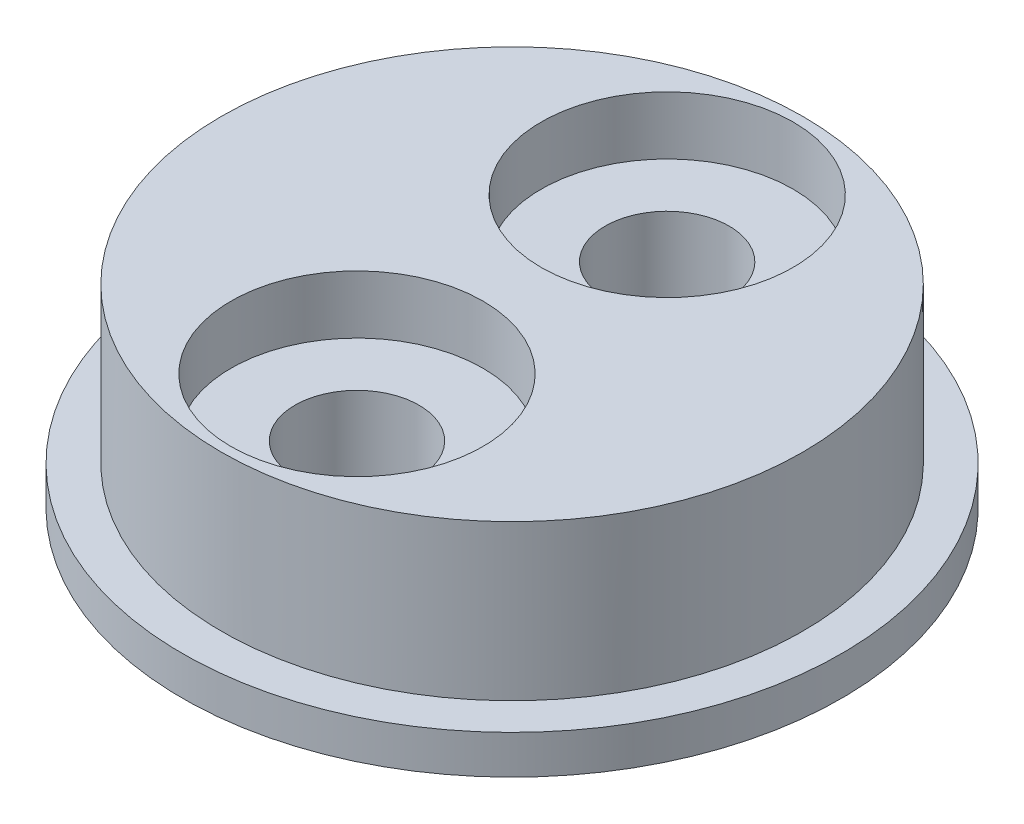
ISO-10303-21;
HEADER;
FILE_DESCRIPTION(('STEP AP214'),'2;1');
FILE_NAME('part.step','',(''),(''),'','','');
FILE_SCHEMA(('AUTOMOTIVE_DESIGN { 1 0 10303 214 1 1 1 1 }'));
ENDSEC;
DATA;
#1=APPLICATION_CONTEXT('core data for automotive mechanical design processes');
#2=APPLICATION_PROTOCOL_DEFINITION('international standard','automotive_design',2000,#1);
#3=PRODUCT_CONTEXT('',#1,'mechanical');
#4=PRODUCT('Part','Part','',(#3));
#5=PRODUCT_RELATED_PRODUCT_CATEGORY('part','',(#4));
#6=PRODUCT_DEFINITION_FORMATION('','',#4);
#7=PRODUCT_DEFINITION_CONTEXT('part definition',#1,'design');
#8=PRODUCT_DEFINITION('design','',#6,#7);
#9=PRODUCT_DEFINITION_SHAPE('','',#8);
#10=(LENGTH_UNIT() NAMED_UNIT(*) SI_UNIT(.MILLI.,.METRE.));
#11=(NAMED_UNIT(*) PLANE_ANGLE_UNIT() SI_UNIT($,.RADIAN.));
#12=(NAMED_UNIT(*) SI_UNIT($,.STERADIAN.) SOLID_ANGLE_UNIT());
#13=UNCERTAINTY_MEASURE_WITH_UNIT(LENGTH_MEASURE(1.E-05),#10,'distance_accuracy_value','');
#14=(GEOMETRIC_REPRESENTATION_CONTEXT(3) GLOBAL_UNCERTAINTY_ASSIGNED_CONTEXT((#13)) GLOBAL_UNIT_ASSIGNED_CONTEXT((#10,
#11,#12)) REPRESENTATION_CONTEXT('',''));
#15=CARTESIAN_POINT('',(0.,0.,0.));
#16=DIRECTION('',(0.,0.,1.));
#17=DIRECTION('',(1.,0.,0.));
#18=AXIS2_PLACEMENT_3D('',#15,#16,#17);
#19=CARTESIAN_POINT('',(0.,5.,0.));
#20=DIRECTION('',(0.,-1.,0.));
#21=DIRECTION('',(0.,0.,-1.));
#22=AXIS2_PLACEMENT_3D('',#19,#20,#21);
#23=CYLINDRICAL_SURFACE('',#22,7.5);
#24=CARTESIAN_POINT('',(0.,5.,0.));
#25=DIRECTION('',(0.,1.,0.));
#26=DIRECTION('',(0.,0.,1.));
#27=AXIS2_PLACEMENT_3D('',#24,#25,#26);
#28=CIRCLE('',#27,7.5);
#29=CARTESIAN_POINT('',(0.,5.,7.5));
#30=VERTEX_POINT('',#29);
#31=EDGE_CURVE('E37',#30,#30,#28,.T.);
#32=ORIENTED_EDGE('',*,*,#31,.F.);
#33=EDGE_LOOP('',(#32));
#34=FACE_BOUND('',#33,.T.);
#35=CARTESIAN_POINT('',(0.,1.,0.));
#36=DIRECTION('',(0.,-1.,0.));
#37=DIRECTION('',(0.,0.,-1.));
#38=AXIS2_PLACEMENT_3D('',#35,#36,#37);
#39=CIRCLE('',#38,7.5);
#40=CARTESIAN_POINT('',(0.,1.,-7.5));
#41=VERTEX_POINT('',#40);
#42=EDGE_CURVE('E10',#41,#41,#39,.T.);
#43=ORIENTED_EDGE('',*,*,#42,.F.);
#44=EDGE_LOOP('',(#43));
#45=FACE_BOUND('',#44,.T.);
#46=ADVANCED_FACE('F31',(#34,#45),#23,.T.);
#47=CARTESIAN_POINT('',(0.,5.,0.));
#48=DIRECTION('',(0.,1.,0.));
#49=DIRECTION('',(0.,0.,1.));
#50=AXIS2_PLACEMENT_3D('',#47,#48,#49);
#51=PLANE('',#50);
#52=CARTESIAN_POINT('',(0.,5.,-4.));
#53=DIRECTION('',(0.,1.,0.));
#54=DIRECTION('',(0.,0.,1.));
#55=AXIS2_PLACEMENT_3D('',#52,#53,#54);
#56=CIRCLE('',#55,3.25);
#57=CARTESIAN_POINT('',(0.,5.,-0.75));
#58=VERTEX_POINT('',#57);
#59=EDGE_CURVE('E45',#58,#58,#56,.T.);
#60=ORIENTED_EDGE('',*,*,#59,.F.);
#61=EDGE_LOOP('',(#60));
#62=FACE_BOUND('',#61,.T.);
#63=CARTESIAN_POINT('',(0.,5.,4.));
#64=DIRECTION('',(0.,1.,0.));
#65=DIRECTION('',(0.,0.,1.));
#66=AXIS2_PLACEMENT_3D('',#63,#64,#65);
#67=CIRCLE('',#66,3.24999999999961);
#68=CARTESIAN_POINT('',(0.,5.,7.24999999999961));
#69=VERTEX_POINT('',#68);
#70=EDGE_CURVE('E48',#69,#69,#67,.T.);
#71=ORIENTED_EDGE('',*,*,#70,.F.);
#72=EDGE_LOOP('',(#71));
#73=FACE_BOUND('',#72,.T.);
#74=ORIENTED_EDGE('',*,*,#31,.T.);
#75=EDGE_LOOP('',(#74));
#76=FACE_BOUND('',#75,.T.);
#77=ADVANCED_FACE('F89',(#62,#73,#76),#51,.T.);
#78=CARTESIAN_POINT('',(0.,3.5,4.));
#79=DIRECTION('',(0.,1.,0.));
#80=DIRECTION('',(0.,0.,1.));
#81=AXIS2_PLACEMENT_3D('',#78,#79,#80);
#82=CYLINDRICAL_SURFACE('',#81,3.24999999999961);
#83=CARTESIAN_POINT('',(0.,3.5,4.));
#84=DIRECTION('',(0.,1.,0.));
#85=DIRECTION('',(0.,0.,1.));
#86=AXIS2_PLACEMENT_3D('',#83,#84,#85);
#87=CIRCLE('',#86,3.24999999999961);
#88=CARTESIAN_POINT('',(0.,3.5,7.24999999999961));
#89=VERTEX_POINT('',#88);
#90=EDGE_CURVE('E51',#89,#89,#87,.T.);
#91=ORIENTED_EDGE('',*,*,#90,.F.);
#92=EDGE_LOOP('',(#91));
#93=FACE_BOUND('',#92,.T.);
#94=ORIENTED_EDGE('',*,*,#70,.T.);
#95=EDGE_LOOP('',(#94));
#96=FACE_BOUND('',#95,.T.);
#97=ADVANCED_FACE('F94',(#93,#96),#82,.F.);
#98=CARTESIAN_POINT('',(0.,3.5,4.));
#99=DIRECTION('',(0.,1.,0.));
#100=DIRECTION('',(0.,0.,1.));
#101=AXIS2_PLACEMENT_3D('',#98,#99,#100);
#102=PLANE('',#101);
#103=CARTESIAN_POINT('',(0.,3.5,4.));
#104=DIRECTION('',(0.,1.,0.));
#105=DIRECTION('',(0.,0.,1.));
#106=AXIS2_PLACEMENT_3D('',#103,#104,#105);
#107=CIRCLE('',#106,1.6);
#108=CARTESIAN_POINT('',(0.,3.5,5.6));
#109=VERTEX_POINT('',#108);
#110=EDGE_CURVE('E65',#109,#109,#107,.T.);
#111=ORIENTED_EDGE('',*,*,#110,.F.);
#112=EDGE_LOOP('',(#111));
#113=FACE_BOUND('',#112,.T.);
#114=ORIENTED_EDGE('',*,*,#90,.T.);
#115=EDGE_LOOP('',(#114));
#116=FACE_BOUND('',#115,.T.);
#117=ADVANCED_FACE('F101',(#113,#116),#102,.T.);
#118=CARTESIAN_POINT('',(0.,3.5,-4.));
#119=DIRECTION('',(0.,1.,0.));
#120=DIRECTION('',(0.,0.,1.));
#121=AXIS2_PLACEMENT_3D('',#118,#119,#120);
#122=CYLINDRICAL_SURFACE('',#121,3.25);
#123=CARTESIAN_POINT('',(0.,3.5,-4.));
#124=DIRECTION('',(0.,1.,0.));
#125=DIRECTION('',(0.,0.,1.));
#126=AXIS2_PLACEMENT_3D('',#123,#124,#125);
#127=CIRCLE('',#126,3.25);
#128=CARTESIAN_POINT('',(0.,3.5,-0.75));
#129=VERTEX_POINT('',#128);
#130=EDGE_CURVE('E41',#129,#129,#127,.T.);
#131=ORIENTED_EDGE('',*,*,#130,.F.);
#132=EDGE_LOOP('',(#131));
#133=FACE_BOUND('',#132,.T.);
#134=ORIENTED_EDGE('',*,*,#59,.T.);
#135=EDGE_LOOP('',(#134));
#136=FACE_BOUND('',#135,.T.);
#137=ADVANCED_FACE('F124',(#133,#136),#122,.F.);
#138=CARTESIAN_POINT('',(0.,3.5,-4.));
#139=DIRECTION('',(0.,1.,0.));
#140=DIRECTION('',(0.,0.,1.));
#141=AXIS2_PLACEMENT_3D('',#138,#139,#140);
#142=PLANE('',#141);
#143=CARTESIAN_POINT('',(0.,3.5,-4.));
#144=DIRECTION('',(0.,1.,0.));
#145=DIRECTION('',(0.,0.,1.));
#146=AXIS2_PLACEMENT_3D('',#143,#144,#145);
#147=CIRCLE('',#146,1.6);
#148=CARTESIAN_POINT('',(0.,3.5,-2.4));
#149=VERTEX_POINT('',#148);
#150=EDGE_CURVE('E60',#149,#149,#147,.T.);
#151=ORIENTED_EDGE('',*,*,#150,.F.);
#152=EDGE_LOOP('',(#151));
#153=FACE_BOUND('',#152,.T.);
#154=ORIENTED_EDGE('',*,*,#130,.T.);
#155=EDGE_LOOP('',(#154));
#156=FACE_BOUND('',#155,.T.);
#157=ADVANCED_FACE('F117',(#153,#156),#142,.T.);
#158=CARTESIAN_POINT('',(0.,1.,0.));
#159=DIRECTION('',(0.,-1.,0.));
#160=DIRECTION('',(0.,0.,-1.));
#161=AXIS2_PLACEMENT_3D('',#158,#159,#160);
#162=CYLINDRICAL_SURFACE('',#161,8.5);
#163=CARTESIAN_POINT('',(0.,1.,0.));
#164=DIRECTION('',(0.,-1.,0.));
#165=DIRECTION('',(0.,0.,-1.));
#166=AXIS2_PLACEMENT_3D('',#163,#164,#165);
#167=CIRCLE('',#166,8.5);
#168=CARTESIAN_POINT('',(0.,1.,-8.5));
#169=VERTEX_POINT('',#168);
#170=EDGE_CURVE('E52',#169,#169,#167,.T.);
#171=ORIENTED_EDGE('',*,*,#170,.T.);
#172=EDGE_LOOP('',(#171));
#173=FACE_BOUND('',#172,.T.);
#174=CARTESIAN_POINT('',(0.,0.,0.));
#175=DIRECTION('',(0.,-1.,0.));
#176=DIRECTION('',(0.,0.,-1.));
#177=AXIS2_PLACEMENT_3D('',#174,#175,#176);
#178=CIRCLE('',#177,8.5);
#179=CARTESIAN_POINT('',(0.,0.,-8.5));
#180=VERTEX_POINT('',#179);
#181=EDGE_CURVE('E57',#180,#180,#178,.T.);
#182=ORIENTED_EDGE('',*,*,#181,.F.);
#183=EDGE_LOOP('',(#182));
#184=FACE_BOUND('',#183,.T.);
#185=ADVANCED_FACE('F112',(#173,#184),#162,.T.);
#186=CARTESIAN_POINT('',(0.,1.,0.));
#187=DIRECTION('',(0.,-1.,0.));
#188=DIRECTION('',(0.,0.,-1.));
#189=AXIS2_PLACEMENT_3D('',#186,#187,#188);
#190=PLANE('',#189);
#191=ORIENTED_EDGE('',*,*,#42,.T.);
#192=EDGE_LOOP('',(#191));
#193=FACE_BOUND('',#192,.T.);
#194=ORIENTED_EDGE('',*,*,#170,.F.);
#195=EDGE_LOOP('',(#194));
#196=FACE_BOUND('',#195,.T.);
#197=ADVANCED_FACE('F108',(#193,#196),#190,.F.);
#198=CARTESIAN_POINT('',(0.,0.,0.));
#199=DIRECTION('',(0.,1.,0.));
#200=DIRECTION('',(0.,0.,1.));
#201=AXIS2_PLACEMENT_3D('',#198,#199,#200);
#202=PLANE('',#201);
#203=CARTESIAN_POINT('',(0.,0.,-4.));
#204=DIRECTION('',(0.,1.,0.));
#205=DIRECTION('',(0.,0.,1.));
#206=AXIS2_PLACEMENT_3D('',#203,#204,#205);
#207=CIRCLE('',#206,1.6);
#208=CARTESIAN_POINT('',(0.,0.,-2.4));
#209=VERTEX_POINT('',#208);
#210=EDGE_CURVE('E68',#209,#209,#207,.T.);
#211=ORIENTED_EDGE('',*,*,#210,.T.);
#212=EDGE_LOOP('',(#211));
#213=FACE_BOUND('',#212,.T.);
#214=CARTESIAN_POINT('',(0.,0.,4.));
#215=DIRECTION('',(0.,1.,0.));
#216=DIRECTION('',(0.,0.,1.));
#217=AXIS2_PLACEMENT_3D('',#214,#215,#216);
#218=CIRCLE('',#217,1.6);
#219=CARTESIAN_POINT('',(0.,0.,5.6));
#220=VERTEX_POINT('',#219);
#221=EDGE_CURVE('E69',#220,#220,#218,.T.);
#222=ORIENTED_EDGE('',*,*,#221,.T.);
#223=EDGE_LOOP('',(#222));
#224=FACE_BOUND('',#223,.T.);
#225=ORIENTED_EDGE('',*,*,#181,.T.);
#226=EDGE_LOOP('',(#225));
#227=FACE_BOUND('',#226,.T.);
#228=ADVANCED_FACE('F75',(#213,#224,#227),#202,.F.);
#229=CARTESIAN_POINT('',(0.,0.,4.));
#230=DIRECTION('',(0.,1.,0.));
#231=DIRECTION('',(0.,0.,1.));
#232=AXIS2_PLACEMENT_3D('',#229,#230,#231);
#233=CYLINDRICAL_SURFACE('',#232,1.6);
#234=ORIENTED_EDGE('',*,*,#110,.T.);
#235=EDGE_LOOP('',(#234));
#236=FACE_BOUND('',#235,.T.);
#237=ORIENTED_EDGE('',*,*,#221,.F.);
#238=EDGE_LOOP('',(#237));
#239=FACE_BOUND('',#238,.T.);
#240=ADVANCED_FACE('F80',(#236,#239),#233,.F.);
#241=CARTESIAN_POINT('',(0.,0.,-4.));
#242=DIRECTION('',(0.,1.,0.));
#243=DIRECTION('',(0.,0.,1.));
#244=AXIS2_PLACEMENT_3D('',#241,#242,#243);
#245=CYLINDRICAL_SURFACE('',#244,1.6);
#246=ORIENTED_EDGE('',*,*,#150,.T.);
#247=EDGE_LOOP('',(#246));
#248=FACE_BOUND('',#247,.T.);
#249=ORIENTED_EDGE('',*,*,#210,.F.);
#250=EDGE_LOOP('',(#249));
#251=FACE_BOUND('',#250,.T.);
#252=ADVANCED_FACE('F78',(#248,#251),#245,.F.);
#253=CLOSED_SHELL('',(#46,#77,#97,#117,#137,#157,#185,#197,#228,#240,#252));
#254=MANIFOLD_SOLID_BREP('B2',#253);
#255=ADVANCED_BREP_SHAPE_REPRESENTATION('',(#18,#254),#14);
#256=SHAPE_DEFINITION_REPRESENTATION(#9,#255);
ENDSEC;
END-ISO-10303-21;
